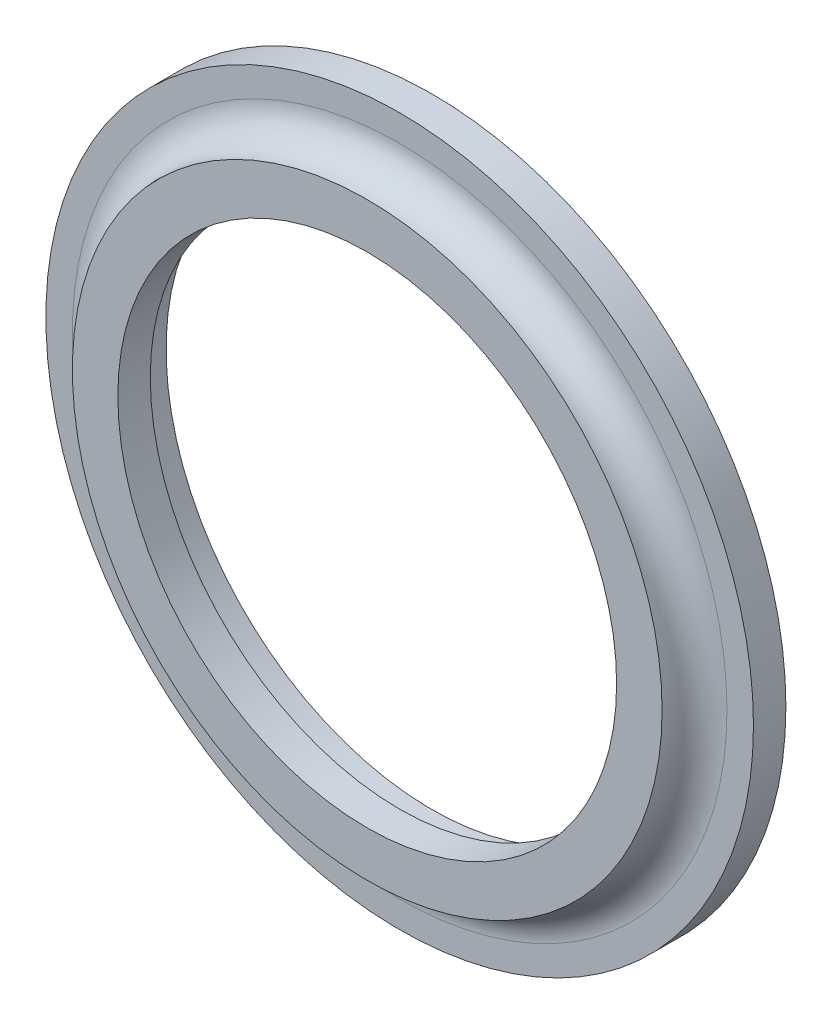
ISO-10303-21;
HEADER;
FILE_DESCRIPTION(('STEP AP214'),'2;1');
FILE_NAME('part.step','',(''),(''),'','','');
FILE_SCHEMA(('AUTOMOTIVE_DESIGN { 1 0 10303 214 1 1 1 1 }'));
ENDSEC;
DATA;
#1=APPLICATION_CONTEXT('core data for automotive mechanical design processes');
#2=APPLICATION_PROTOCOL_DEFINITION('international standard','automotive_design',2000,#1);
#3=PRODUCT_CONTEXT('',#1,'mechanical');
#4=PRODUCT('Part','Part','',(#3));
#5=PRODUCT_RELATED_PRODUCT_CATEGORY('part','',(#4));
#6=PRODUCT_DEFINITION_FORMATION('','',#4);
#7=PRODUCT_DEFINITION_CONTEXT('part definition',#1,'design');
#8=PRODUCT_DEFINITION('design','',#6,#7);
#9=PRODUCT_DEFINITION_SHAPE('','',#8);
#10=(LENGTH_UNIT() NAMED_UNIT(*) SI_UNIT(.MILLI.,.METRE.));
#11=(NAMED_UNIT(*) PLANE_ANGLE_UNIT() SI_UNIT($,.RADIAN.));
#12=(NAMED_UNIT(*) SI_UNIT($,.STERADIAN.) SOLID_ANGLE_UNIT());
#13=UNCERTAINTY_MEASURE_WITH_UNIT(LENGTH_MEASURE(1.E-05),#10,'distance_accuracy_value','');
#14=(GEOMETRIC_REPRESENTATION_CONTEXT(3) GLOBAL_UNCERTAINTY_ASSIGNED_CONTEXT((#13)) GLOBAL_UNIT_ASSIGNED_CONTEXT((#10,
#11,#12)) REPRESENTATION_CONTEXT('',''));
#15=CARTESIAN_POINT('',(0.,0.,0.));
#16=DIRECTION('',(0.,0.,1.));
#17=DIRECTION('',(1.,0.,0.));
#18=AXIS2_PLACEMENT_3D('',#15,#16,#17);
#19=CARTESIAN_POINT('',(0.,0.,5.));
#20=DIRECTION('',(0.,0.,1.));
#21=DIRECTION('',(1.,0.,0.));
#22=AXIS2_PLACEMENT_3D('',#19,#20,#21);
#23=PLANE('',#22);
#24=CARTESIAN_POINT('',(0.,0.,5.));
#25=DIRECTION('',(0.,0.,1.));
#26=DIRECTION('',(1.,0.,0.));
#27=AXIS2_PLACEMENT_3D('',#24,#25,#26);
#28=CIRCLE('',#27,50.4417340010106);
#29=CARTESIAN_POINT('',(50.4417340010106,0.,5.));
#30=VERTEX_POINT('',#29);
#31=EDGE_CURVE('E10',#30,#30,#28,.F.);
#32=ORIENTED_EDGE('',*,*,#31,.T.);
#33=EDGE_LOOP('',(#32));
#34=FACE_BOUND('',#33,.T.);
#35=CARTESIAN_POINT('',(0.,0.,5.));
#36=DIRECTION('',(0.,0.,1.));
#37=DIRECTION('',(1.,0.,0.));
#38=AXIS2_PLACEMENT_3D('',#35,#36,#37);
#39=CIRCLE('',#38,54.524863565064);
#40=CARTESIAN_POINT('',(54.524863565064,0.,5.));
#41=VERTEX_POINT('',#40);
#42=EDGE_CURVE('E50',#41,#41,#39,.T.);
#43=ORIENTED_EDGE('',*,*,#42,.T.);
#44=EDGE_LOOP('',(#43));
#45=FACE_BOUND('',#44,.T.);
#46=ADVANCED_FACE('F43',(#34,#45),#23,.T.);
#47=CARTESIAN_POINT('',(0.,0.,0.));
#48=DIRECTION('',(0.,0.,1.));
#49=DIRECTION('',(1.,0.,0.));
#50=AXIS2_PLACEMENT_3D('',#47,#48,#49);
#51=PLANE('',#50);
#52=CARTESIAN_POINT('',(0.,0.,0.));
#53=DIRECTION('',(0.,0.,1.));
#54=DIRECTION('',(1.,0.,0.));
#55=AXIS2_PLACEMENT_3D('',#52,#53,#54);
#56=CIRCLE('',#55,54.524863565064);
#57=CARTESIAN_POINT('',(54.524863565064,0.,0.));
#58=VERTEX_POINT('',#57);
#59=EDGE_CURVE('E54',#58,#58,#56,.T.);
#60=ORIENTED_EDGE('',*,*,#59,.F.);
#61=EDGE_LOOP('',(#60));
#62=FACE_BOUND('',#61,.T.);
#63=CARTESIAN_POINT('',(0.,0.,0.));
#64=DIRECTION('',(0.,0.,1.));
#65=DIRECTION('',(1.,0.,0.));
#66=AXIS2_PLACEMENT_3D('',#63,#64,#65);
#67=CIRCLE('',#66,41.);
#68=CARTESIAN_POINT('',(41.,0.,0.));
#69=VERTEX_POINT('',#68);
#70=EDGE_CURVE('E59',#69,#69,#67,.T.);
#71=ORIENTED_EDGE('',*,*,#70,.T.);
#72=EDGE_LOOP('',(#71));
#73=FACE_BOUND('',#72,.T.);
#74=ADVANCED_FACE('F93',(#62,#73),#51,.F.);
#75=CARTESIAN_POINT('',(0.,0.,5.));
#76=DIRECTION('',(0.,0.,-1.));
#77=DIRECTION('',(-1.,0.,0.));
#78=AXIS2_PLACEMENT_3D('',#75,#76,#77);
#79=CYLINDRICAL_SURFACE('',#78,54.524863565064);
#80=ORIENTED_EDGE('',*,*,#42,.F.);
#81=EDGE_LOOP('',(#80));
#82=FACE_BOUND('',#81,.T.);
#83=ORIENTED_EDGE('',*,*,#59,.T.);
#84=EDGE_LOOP('',(#83));
#85=FACE_BOUND('',#84,.T.);
#86=ADVANCED_FACE('F99',(#82,#85),#79,.T.);
#87=CARTESIAN_POINT('',(0.,0.,5.));
#88=DIRECTION('',(0.,0.,-1.));
#89=DIRECTION('',(-1.,0.,0.));
#90=AXIS2_PLACEMENT_3D('',#87,#88,#89);
#91=CYLINDRICAL_SURFACE('',#90,41.);
#92=CARTESIAN_POINT('',(0.,0.,5.));
#93=DIRECTION('',(0.,0.,1.));
#94=DIRECTION('',(1.,0.,0.));
#95=AXIS2_PLACEMENT_3D('',#92,#93,#94);
#96=CIRCLE('',#95,41.);
#97=CARTESIAN_POINT('',(41.,0.,5.));
#98=VERTEX_POINT('',#97);
#99=EDGE_CURVE('E63',#98,#98,#96,.T.);
#100=ORIENTED_EDGE('',*,*,#99,.T.);
#101=EDGE_LOOP('',(#100));
#102=FACE_BOUND('',#101,.T.);
#103=ORIENTED_EDGE('',*,*,#70,.F.);
#104=EDGE_LOOP('',(#103));
#105=FACE_BOUND('',#104,.T.);
#106=ADVANCED_FACE('F89',(#102,#105),#91,.F.);
#107=CARTESIAN_POINT('',(0.,0.,5.));
#108=DIRECTION('',(0.,0.,1.));
#109=DIRECTION('',(1.,0.,0.));
#110=AXIS2_PLACEMENT_3D('',#107,#108,#109);
#111=PLANE('',#110);
#112=CARTESIAN_POINT('',(0.,0.,5.));
#113=DIRECTION('',(0.,0.,1.));
#114=DIRECTION('',(1.,0.,0.));
#115=AXIS2_PLACEMENT_3D('',#112,#113,#114);
#116=CIRCLE('',#115,38.4351462276446);
#117=CARTESIAN_POINT('',(38.4351462276446,0.,5.));
#118=VERTEX_POINT('',#117);
#119=EDGE_CURVE('E70',#118,#118,#116,.T.);
#120=ORIENTED_EDGE('',*,*,#119,.T.);
#121=EDGE_LOOP('',(#120));
#122=FACE_BOUND('',#121,.T.);
#123=ORIENTED_EDGE('',*,*,#99,.F.);
#124=EDGE_LOOP('',(#123));
#125=FACE_BOUND('',#124,.T.);
#126=ADVANCED_FACE('F81',(#122,#125),#111,.F.);
#127=CARTESIAN_POINT('',(0.,0.,10.));
#128=DIRECTION('',(0.,0.,1.));
#129=DIRECTION('',(1.,0.,0.));
#130=AXIS2_PLACEMENT_3D('',#127,#128,#129);
#131=PLANE('',#130);
#132=CARTESIAN_POINT('',(0.,0.,10.));
#133=DIRECTION('',(0.,0.,1.));
#134=DIRECTION('',(1.,0.,0.));
#135=AXIS2_PLACEMENT_3D('',#132,#133,#134);
#136=CIRCLE('',#135,45.4417340010106);
#137=CARTESIAN_POINT('',(45.4417340010106,0.,10.));
#138=VERTEX_POINT('',#137);
#139=EDGE_CURVE('E66',#138,#138,#136,.T.);
#140=ORIENTED_EDGE('',*,*,#139,.T.);
#141=EDGE_LOOP('',(#140));
#142=FACE_BOUND('',#141,.T.);
#143=CARTESIAN_POINT('',(0.,0.,10.));
#144=DIRECTION('',(0.,0.,1.));
#145=DIRECTION('',(1.,0.,0.));
#146=AXIS2_PLACEMENT_3D('',#143,#144,#145);
#147=CIRCLE('',#146,38.4351462276446);
#148=CARTESIAN_POINT('',(38.4351462276446,0.,10.));
#149=VERTEX_POINT('',#148);
#150=EDGE_CURVE('E69',#149,#149,#147,.T.);
#151=ORIENTED_EDGE('',*,*,#150,.F.);
#152=EDGE_LOOP('',(#151));
#153=FACE_BOUND('',#152,.T.);
#154=ADVANCED_FACE('F79',(#142,#153),#131,.T.);
#155=CARTESIAN_POINT('',(0.,0.,10.));
#156=DIRECTION('',(0.,0.,-1.));
#157=DIRECTION('',(-1.,0.,0.));
#158=AXIS2_PLACEMENT_3D('',#155,#156,#157);
#159=CYLINDRICAL_SURFACE('',#158,38.4351462276446);
#160=ORIENTED_EDGE('',*,*,#150,.T.);
#161=EDGE_LOOP('',(#160));
#162=FACE_BOUND('',#161,.T.);
#163=ORIENTED_EDGE('',*,*,#119,.F.);
#164=EDGE_LOOP('',(#163));
#165=FACE_BOUND('',#164,.T.);
#166=ADVANCED_FACE('F76',(#162,#165),#159,.F.);
#167=CARTESIAN_POINT('',(0.,0.,10.));
#168=DIRECTION('',(0.,0.,1.));
#169=DIRECTION('',(1.,0.,0.));
#170=AXIS2_PLACEMENT_3D('',#167,#168,#169);
#171=TOROIDAL_SURFACE('',#170,50.4417340010106,5.);
#172=ORIENTED_EDGE('',*,*,#31,.F.);
#173=EDGE_LOOP('',(#172));
#174=FACE_BOUND('',#173,.T.);
#175=ORIENTED_EDGE('',*,*,#139,.F.);
#176=EDGE_LOOP('',(#175));
#177=FACE_BOUND('',#176,.T.);
#178=ADVANCED_FACE('F45',(#174,#177),#171,.F.);
#179=CLOSED_SHELL('',(#46,#74,#86,#106,#126,#154,#166,#178));
#180=MANIFOLD_SOLID_BREP('B2',#179);
#181=ADVANCED_BREP_SHAPE_REPRESENTATION('',(#18,#180),#14);
#182=SHAPE_DEFINITION_REPRESENTATION(#9,#181);
ENDSEC;
END-ISO-10303-21;
